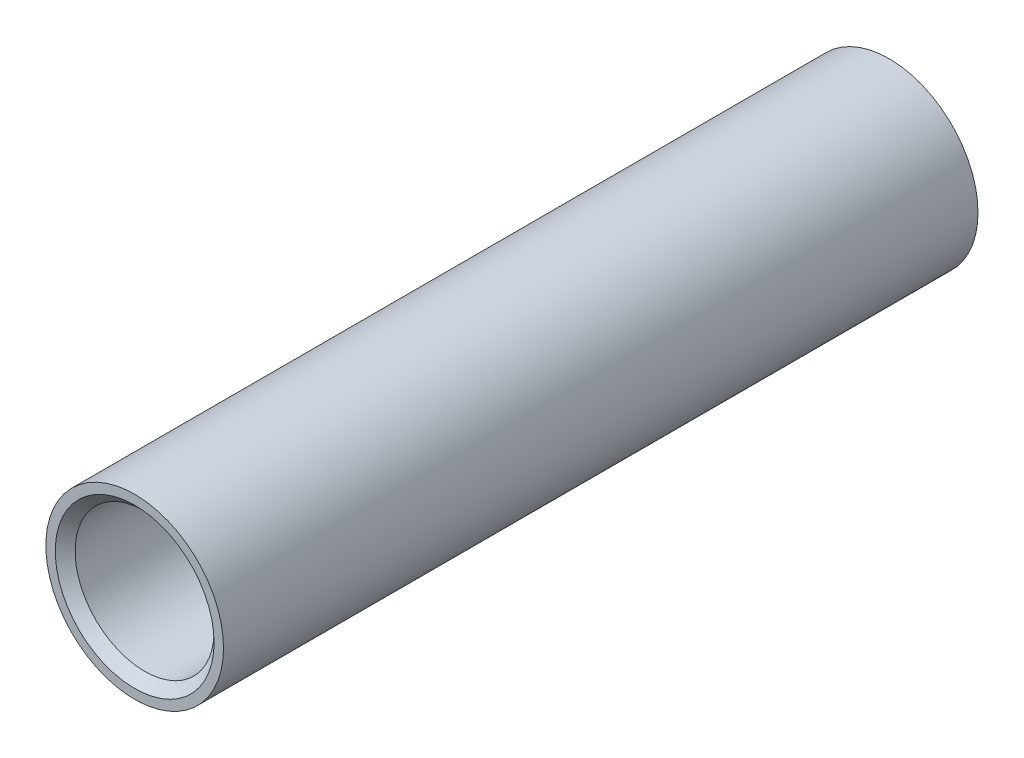
ISO-10303-21;
HEADER;
FILE_DESCRIPTION(('STEP AP214'),'2;1');
FILE_NAME('part.step','',(''),(''),'','','');
FILE_SCHEMA(('AUTOMOTIVE_DESIGN { 1 0 10303 214 1 1 1 1 }'));
ENDSEC;
DATA;
#1=APPLICATION_CONTEXT('core data for automotive mechanical design processes');
#2=APPLICATION_PROTOCOL_DEFINITION('international standard','automotive_design',2000,#1);
#3=PRODUCT_CONTEXT('',#1,'mechanical');
#4=PRODUCT('Part','Part','',(#3));
#5=PRODUCT_RELATED_PRODUCT_CATEGORY('part','',(#4));
#6=PRODUCT_DEFINITION_FORMATION('','',#4);
#7=PRODUCT_DEFINITION_CONTEXT('part definition',#1,'design');
#8=PRODUCT_DEFINITION('design','',#6,#7);
#9=PRODUCT_DEFINITION_SHAPE('','',#8);
#10=(LENGTH_UNIT() NAMED_UNIT(*) SI_UNIT(.MILLI.,.METRE.));
#11=(NAMED_UNIT(*) PLANE_ANGLE_UNIT() SI_UNIT($,.RADIAN.));
#12=(NAMED_UNIT(*) SI_UNIT($,.STERADIAN.) SOLID_ANGLE_UNIT());
#13=UNCERTAINTY_MEASURE_WITH_UNIT(LENGTH_MEASURE(1.E-05),#10,'distance_accuracy_value','');
#14=(GEOMETRIC_REPRESENTATION_CONTEXT(3) GLOBAL_UNCERTAINTY_ASSIGNED_CONTEXT((#13)) GLOBAL_UNIT_ASSIGNED_CONTEXT((#10,
#11,#12)) REPRESENTATION_CONTEXT('',''));
#15=CARTESIAN_POINT('',(0.,0.,0.));
#16=DIRECTION('',(0.,0.,1.));
#17=DIRECTION('',(1.,0.,0.));
#18=AXIS2_PLACEMENT_3D('',#15,#16,#17);
#19=CARTESIAN_POINT('',(-7.5,0.,73.5000069831337));
#20=DIRECTION('',(0.,0.,1.));
#21=DIRECTION('',(1.,0.,0.));
#22=AXIS2_PLACEMENT_3D('',#19,#20,#21);
#23=CONICAL_SURFACE('',#22,3.49999676297681,0.785396703374729);
#24=CARTESIAN_POINT('',(-7.5,0.,73.50000374612));
#25=DIRECTION('',(0.,0.,1.));
#26=DIRECTION('',(1.,0.,0.));
#27=AXIS2_PLACEMENT_3D('',#24,#25,#26);
#28=CIRCLE('',#27,3.5);
#29=CARTESIAN_POINT('',(-4.,0.,73.50000374612));
#30=VERTEX_POINT('',#29);
#31=EDGE_CURVE('E31',#30,#30,#28,.F.);
#32=ORIENTED_EDGE('',*,*,#31,.T.);
#33=EDGE_LOOP('',(#32));
#34=FACE_BOUND('',#33,.T.);
#35=CARTESIAN_POINT('',(-7.5,0.,74.));
#36=DIRECTION('',(0.,0.,1.));
#37=DIRECTION('',(1.,0.,0.));
#38=AXIS2_PLACEMENT_3D('',#35,#36,#37);
#39=CIRCLE('',#38,3.99998831984286);
#40=CARTESIAN_POINT('',(-3.50001168015714,0.,74.));
#41=VERTEX_POINT('',#40);
#42=EDGE_CURVE('E19',#41,#41,#39,.T.);
#43=ORIENTED_EDGE('',*,*,#42,.T.);
#44=EDGE_LOOP('',(#43));
#45=FACE_BOUND('',#44,.T.);
#46=ADVANCED_FACE('F15',(#34,#45),#23,.F.);
#47=CARTESIAN_POINT('',(-12.154,-4.654,74.));
#48=DIRECTION('',(0.,0.,1.));
#49=DIRECTION('',(1.,0.,0.));
#50=AXIS2_PLACEMENT_3D('',#47,#48,#49);
#51=PLANE('',#50);
#52=ORIENTED_EDGE('',*,*,#42,.F.);
#53=EDGE_LOOP('',(#52));
#54=FACE_BOUND('',#53,.T.);
#55=CARTESIAN_POINT('',(-7.5,0.,74.));
#56=DIRECTION('',(0.,0.,1.));
#57=DIRECTION('',(1.,0.,0.));
#58=AXIS2_PLACEMENT_3D('',#55,#56,#57);
#59=CIRCLE('',#58,4.475);
#60=CARTESIAN_POINT('',(-3.025,0.,74.));
#61=VERTEX_POINT('',#60);
#62=EDGE_CURVE('E33',#61,#61,#59,.T.);
#63=ORIENTED_EDGE('',*,*,#62,.T.);
#64=EDGE_LOOP('',(#63));
#65=FACE_BOUND('',#64,.T.);
#66=ADVANCED_FACE('F45',(#54,#65),#51,.T.);
#67=CARTESIAN_POINT('',(-7.5,0.,36.49999625388));
#68=DIRECTION('',(0.,0.,1.));
#69=DIRECTION('',(1.,0.,0.));
#70=AXIS2_PLACEMENT_3D('',#67,#68,#69);
#71=CYLINDRICAL_SURFACE('',#70,3.5);
#72=CARTESIAN_POINT('',(-7.5,0.,36.4999930168663));
#73=DIRECTION('',(0.,0.,-1.));
#74=DIRECTION('',(0.,-1.,0.));
#75=AXIS2_PLACEMENT_3D('',#72,#73,#74);
#76=CIRCLE('',#75,3.49999676297681);
#77=CARTESIAN_POINT('',(-7.5,-3.49999676297681,36.4999930168663));
#78=VERTEX_POINT('',#77);
#79=EDGE_CURVE('E28',#78,#78,#76,.T.);
#80=ORIENTED_EDGE('',*,*,#79,.T.);
#81=EDGE_LOOP('',(#80));
#82=FACE_BOUND('',#81,.T.);
#83=ORIENTED_EDGE('',*,*,#31,.F.);
#84=EDGE_LOOP('',(#83));
#85=FACE_BOUND('',#84,.T.);
#86=ADVANCED_FACE('F47',(#82,#85),#71,.F.);
#87=CARTESIAN_POINT('',(-7.5,0.,36.));
#88=DIRECTION('',(0.,0.,1.));
#89=DIRECTION('',(1.,0.,0.));
#90=AXIS2_PLACEMENT_3D('',#87,#88,#89);
#91=CYLINDRICAL_SURFACE('',#90,4.475);
#92=ORIENTED_EDGE('',*,*,#62,.F.);
#93=EDGE_LOOP('',(#92));
#94=FACE_BOUND('',#93,.T.);
#95=CARTESIAN_POINT('',(-7.5,0.,36.));
#96=DIRECTION('',(0.,0.,1.));
#97=DIRECTION('',(1.,0.,0.));
#98=AXIS2_PLACEMENT_3D('',#95,#96,#97);
#99=CIRCLE('',#98,4.475);
#100=CARTESIAN_POINT('',(-3.025,0.,36.));
#101=VERTEX_POINT('',#100);
#102=EDGE_CURVE('E23',#101,#101,#99,.T.);
#103=ORIENTED_EDGE('',*,*,#102,.T.);
#104=EDGE_LOOP('',(#103));
#105=FACE_BOUND('',#104,.T.);
#106=ADVANCED_FACE('F53',(#94,#105),#91,.T.);
#107=CARTESIAN_POINT('',(-7.5,0.,36.4999930168663));
#108=DIRECTION('',(0.,0.,-1.));
#109=DIRECTION('',(-1.,0.,0.));
#110=AXIS2_PLACEMENT_3D('',#107,#108,#109);
#111=CONICAL_SURFACE('',#110,3.49999676297681,0.785396703374721);
#112=ORIENTED_EDGE('',*,*,#79,.F.);
#113=EDGE_LOOP('',(#112));
#114=FACE_BOUND('',#113,.T.);
#115=CARTESIAN_POINT('',(-7.5,0.,36.));
#116=DIRECTION('',(0.,0.,1.));
#117=DIRECTION('',(1.,0.,0.));
#118=AXIS2_PLACEMENT_3D('',#115,#116,#117);
#119=CIRCLE('',#118,3.99998831984287);
#120=CARTESIAN_POINT('',(-3.50001168015713,0.,36.));
#121=VERTEX_POINT('',#120);
#122=EDGE_CURVE('E10',#121,#121,#119,.F.);
#123=ORIENTED_EDGE('',*,*,#122,.T.);
#124=EDGE_LOOP('',(#123));
#125=FACE_BOUND('',#124,.T.);
#126=ADVANCED_FACE('F58',(#114,#125),#111,.F.);
#127=CARTESIAN_POINT('',(-12.154,-4.654,36.));
#128=DIRECTION('',(0.,0.,1.));
#129=DIRECTION('',(1.,0.,0.));
#130=AXIS2_PLACEMENT_3D('',#127,#128,#129);
#131=PLANE('',#130);
#132=ORIENTED_EDGE('',*,*,#122,.F.);
#133=EDGE_LOOP('',(#132));
#134=FACE_BOUND('',#133,.T.);
#135=ORIENTED_EDGE('',*,*,#102,.F.);
#136=EDGE_LOOP('',(#135));
#137=FACE_BOUND('',#136,.T.);
#138=ADVANCED_FACE('F17',(#134,#137),#131,.F.);
#139=CLOSED_SHELL('',(#46,#66,#86,#106,#126,#138));
#140=MANIFOLD_SOLID_BREP('B1',#139);
#141=ADVANCED_BREP_SHAPE_REPRESENTATION('',(#18,#140),#14);
#142=SHAPE_DEFINITION_REPRESENTATION(#9,#141);
ENDSEC;
END-ISO-10303-21;
